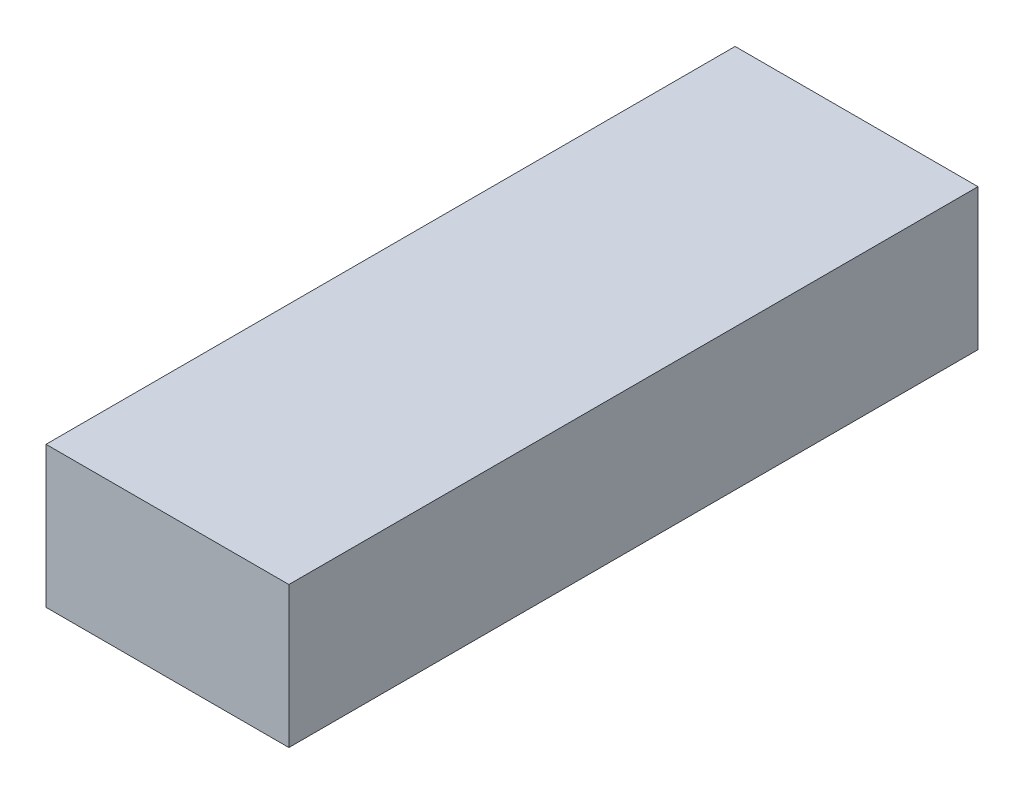
ISO-10303-21;
HEADER;
FILE_DESCRIPTION(('STEP AP214'),'2;1');
FILE_NAME('part.step','',(''),(''),'','','');
FILE_SCHEMA(('AUTOMOTIVE_DESIGN { 1 0 10303 214 1 1 1 1 }'));
ENDSEC;
DATA;
#1=APPLICATION_CONTEXT('core data for automotive mechanical design processes');
#2=APPLICATION_PROTOCOL_DEFINITION('international standard','automotive_design',2000,#1);
#3=PRODUCT_CONTEXT('',#1,'mechanical');
#4=PRODUCT('Part','Part','',(#3));
#5=PRODUCT_RELATED_PRODUCT_CATEGORY('part','',(#4));
#6=PRODUCT_DEFINITION_FORMATION('','',#4);
#7=PRODUCT_DEFINITION_CONTEXT('part definition',#1,'design');
#8=PRODUCT_DEFINITION('design','',#6,#7);
#9=PRODUCT_DEFINITION_SHAPE('','',#8);
#10=(LENGTH_UNIT() NAMED_UNIT(*) SI_UNIT(.MILLI.,.METRE.));
#11=(NAMED_UNIT(*) PLANE_ANGLE_UNIT() SI_UNIT($,.RADIAN.));
#12=(NAMED_UNIT(*) SI_UNIT($,.STERADIAN.) SOLID_ANGLE_UNIT());
#13=UNCERTAINTY_MEASURE_WITH_UNIT(LENGTH_MEASURE(1.E-05),#10,'distance_accuracy_value','');
#14=(GEOMETRIC_REPRESENTATION_CONTEXT(3) GLOBAL_UNCERTAINTY_ASSIGNED_CONTEXT((#13)) GLOBAL_UNIT_ASSIGNED_CONTEXT((#10,
#11,#12)) REPRESENTATION_CONTEXT('',''));
#15=CARTESIAN_POINT('',(0.,0.,0.));
#16=DIRECTION('',(0.,0.,1.));
#17=DIRECTION('',(1.,0.,0.));
#18=AXIS2_PLACEMENT_3D('',#15,#16,#17);
#19=CARTESIAN_POINT('',(-20.5,13.5,-67.));
#20=DIRECTION('',(-1.,0.,0.));
#21=DIRECTION('',(0.,-1.,0.));
#22=AXIS2_PLACEMENT_3D('',#19,#20,#21);
#23=PLANE('',#22);
#24=DIRECTION('',(0.,0.,1.));
#25=VECTOR('',#24,1.);
#26=CARTESIAN_POINT('',(-20.5,-11.5,-67.));
#27=LINE('',#26,#25);
#28=CARTESIAN_POINT('',(-20.5,-11.5,-67.));
#29=VERTEX_POINT('',#28);
#30=CARTESIAN_POINT('',(-20.5,-11.5,55.));
#31=VERTEX_POINT('',#30);
#32=EDGE_CURVE('E38',#29,#31,#27,.T.);
#33=ORIENTED_EDGE('',*,*,#32,.T.);
#34=DIRECTION('',(0.,-1.,0.));
#35=VECTOR('',#34,1.);
#36=CARTESIAN_POINT('',(-20.5,13.5,55.));
#37=LINE('',#36,#35);
#38=CARTESIAN_POINT('',(-20.5,13.5,55.));
#39=VERTEX_POINT('',#38);
#40=EDGE_CURVE('E75',#39,#31,#37,.T.);
#41=ORIENTED_EDGE('',*,*,#40,.F.);
#42=DIRECTION('',(0.,0.,1.));
#43=VECTOR('',#42,1.);
#44=CARTESIAN_POINT('',(-20.5,13.5,-67.));
#45=LINE('',#44,#43);
#46=CARTESIAN_POINT('',(-20.5,13.5,-67.));
#47=VERTEX_POINT('',#46);
#48=EDGE_CURVE('E11',#47,#39,#45,.T.);
#49=ORIENTED_EDGE('',*,*,#48,.F.);
#50=DIRECTION('',(0.,-1.,0.));
#51=VECTOR('',#50,1.);
#52=CARTESIAN_POINT('',(-20.5,13.5,-67.));
#53=LINE('',#52,#51);
#54=EDGE_CURVE('E76',#47,#29,#53,.T.);
#55=ORIENTED_EDGE('',*,*,#54,.T.);
#56=EDGE_LOOP('',(#33,#41,#49,#55));
#57=FACE_BOUND('',#56,.T.);
#58=ADVANCED_FACE('F35',(#57),#23,.T.);
#59=CARTESIAN_POINT('',(-20.5,13.5,-67.));
#60=DIRECTION('',(0.,1.,0.));
#61=DIRECTION('',(0.,0.,1.));
#62=AXIS2_PLACEMENT_3D('',#59,#60,#61);
#63=PLANE('',#62);
#64=ORIENTED_EDGE('',*,*,#48,.T.);
#65=DIRECTION('',(-1.,0.,0.));
#66=VECTOR('',#65,1.);
#67=CARTESIAN_POINT('',(-20.5,13.5,55.));
#68=LINE('',#67,#66);
#69=CARTESIAN_POINT('',(22.5,13.5,55.));
#70=VERTEX_POINT('',#69);
#71=EDGE_CURVE('E92',#70,#39,#68,.T.);
#72=ORIENTED_EDGE('',*,*,#71,.F.);
#73=DIRECTION('',(0.,0.,1.));
#74=VECTOR('',#73,1.);
#75=CARTESIAN_POINT('',(22.5,13.5,-67.));
#76=LINE('',#75,#74);
#77=CARTESIAN_POINT('',(22.5,13.5,-67.));
#78=VERTEX_POINT('',#77);
#79=EDGE_CURVE('E43',#78,#70,#76,.T.);
#80=ORIENTED_EDGE('',*,*,#79,.F.);
#81=DIRECTION('',(-1.,0.,0.));
#82=VECTOR('',#81,1.);
#83=CARTESIAN_POINT('',(-20.5,13.5,-67.));
#84=LINE('',#83,#82);
#85=EDGE_CURVE('E81',#78,#47,#84,.T.);
#86=ORIENTED_EDGE('',*,*,#85,.T.);
#87=EDGE_LOOP('',(#64,#72,#80,#86));
#88=FACE_BOUND('',#87,.T.);
#89=ADVANCED_FACE('F107',(#88),#63,.T.);
#90=CARTESIAN_POINT('',(22.5,13.5,-67.));
#91=DIRECTION('',(1.,0.,0.));
#92=DIRECTION('',(0.,1.,0.));
#93=AXIS2_PLACEMENT_3D('',#90,#91,#92);
#94=PLANE('',#93);
#95=ORIENTED_EDGE('',*,*,#79,.T.);
#96=DIRECTION('',(0.,1.,0.));
#97=VECTOR('',#96,1.);
#98=CARTESIAN_POINT('',(22.5,13.5,55.));
#99=LINE('',#98,#97);
#100=CARTESIAN_POINT('',(22.5,-11.5,55.));
#101=VERTEX_POINT('',#100);
#102=EDGE_CURVE('E88',#101,#70,#99,.T.);
#103=ORIENTED_EDGE('',*,*,#102,.F.);
#104=DIRECTION('',(0.,0.,1.));
#105=VECTOR('',#104,1.);
#106=CARTESIAN_POINT('',(22.5,-11.5,-67.));
#107=LINE('',#106,#105);
#108=CARTESIAN_POINT('',(22.5,-11.5,-67.));
#109=VERTEX_POINT('',#108);
#110=EDGE_CURVE('E80',#109,#101,#107,.T.);
#111=ORIENTED_EDGE('',*,*,#110,.F.);
#112=DIRECTION('',(0.,1.,0.));
#113=VECTOR('',#112,1.);
#114=CARTESIAN_POINT('',(22.5,13.5,-67.));
#115=LINE('',#114,#113);
#116=EDGE_CURVE('E100',#109,#78,#115,.T.);
#117=ORIENTED_EDGE('',*,*,#116,.T.);
#118=EDGE_LOOP('',(#95,#103,#111,#117));
#119=FACE_BOUND('',#118,.T.);
#120=ADVANCED_FACE('F104',(#119),#94,.T.);
#121=CARTESIAN_POINT('',(-20.5,-11.5,-67.));
#122=DIRECTION('',(0.,-1.,0.));
#123=DIRECTION('',(0.,0.,-1.));
#124=AXIS2_PLACEMENT_3D('',#121,#122,#123);
#125=PLANE('',#124);
#126=ORIENTED_EDGE('',*,*,#110,.T.);
#127=DIRECTION('',(1.,0.,0.));
#128=VECTOR('',#127,1.);
#129=CARTESIAN_POINT('',(-20.5,-11.5,55.));
#130=LINE('',#129,#128);
#131=EDGE_CURVE('E83',#31,#101,#130,.T.);
#132=ORIENTED_EDGE('',*,*,#131,.F.);
#133=ORIENTED_EDGE('',*,*,#32,.F.);
#134=DIRECTION('',(1.,0.,0.));
#135=VECTOR('',#134,1.);
#136=CARTESIAN_POINT('',(-20.5,-11.5,-67.));
#137=LINE('',#136,#135);
#138=EDGE_CURVE('E98',#29,#109,#137,.T.);
#139=ORIENTED_EDGE('',*,*,#138,.T.);
#140=EDGE_LOOP('',(#126,#132,#133,#139));
#141=FACE_BOUND('',#140,.T.);
#142=ADVANCED_FACE('F84',(#141),#125,.T.);
#143=CARTESIAN_POINT('',(-20.5,-11.5,-67.));
#144=DIRECTION('',(0.,0.,1.));
#145=DIRECTION('',(1.,0.,0.));
#146=AXIS2_PLACEMENT_3D('',#143,#144,#145);
#147=PLANE('',#146);
#148=ORIENTED_EDGE('',*,*,#54,.F.);
#149=ORIENTED_EDGE('',*,*,#85,.F.);
#150=ORIENTED_EDGE('',*,*,#116,.F.);
#151=ORIENTED_EDGE('',*,*,#138,.F.);
#152=EDGE_LOOP('',(#148,#149,#150,#151));
#153=FACE_BOUND('',#152,.T.);
#154=ADVANCED_FACE('F109',(#153),#147,.F.);
#155=CARTESIAN_POINT('',(-20.5,-11.5,55.));
#156=DIRECTION('',(0.,0.,1.));
#157=DIRECTION('',(1.,0.,0.));
#158=AXIS2_PLACEMENT_3D('',#155,#156,#157);
#159=PLANE('',#158);
#160=ORIENTED_EDGE('',*,*,#40,.T.);
#161=ORIENTED_EDGE('',*,*,#131,.T.);
#162=ORIENTED_EDGE('',*,*,#102,.T.);
#163=ORIENTED_EDGE('',*,*,#71,.T.);
#164=EDGE_LOOP('',(#160,#161,#162,#163));
#165=FACE_BOUND('',#164,.T.);
#166=ADVANCED_FACE('F91',(#165),#159,.T.);
#167=CLOSED_SHELL('',(#58,#89,#120,#142,#154,#166));
#168=MANIFOLD_SOLID_BREP('B2',#167);
#169=ADVANCED_BREP_SHAPE_REPRESENTATION('',(#18,#168),#14);
#170=SHAPE_DEFINITION_REPRESENTATION(#9,#169);
ENDSEC;
END-ISO-10303-21;
